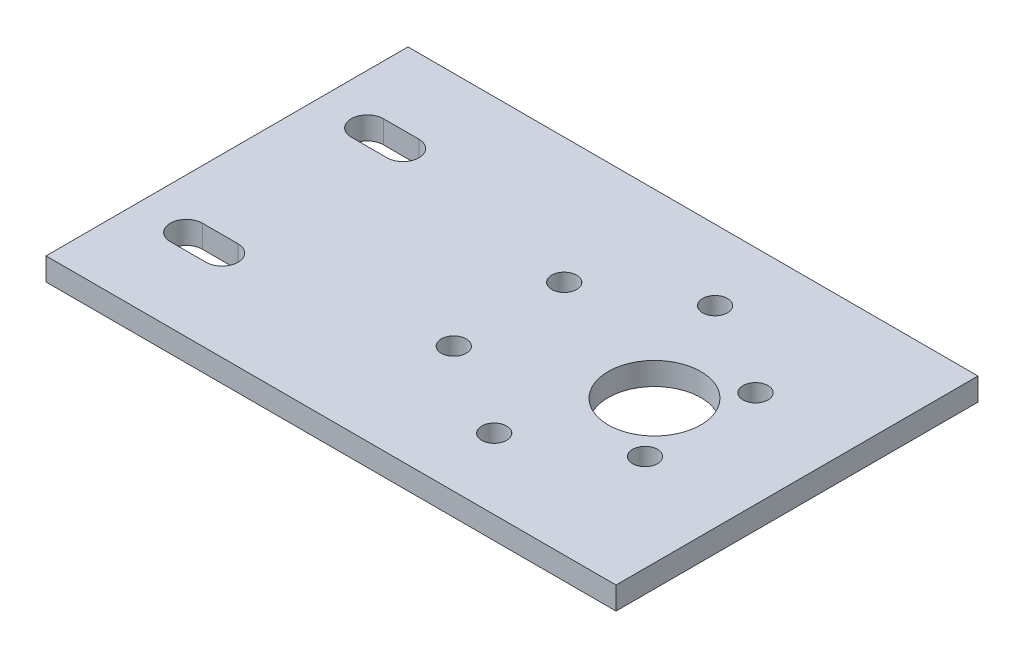
ISO-10303-21;
HEADER;
FILE_DESCRIPTION(('STEP AP214'),'2;1');
FILE_NAME('part.step','',(''),(''),'','','');
FILE_SCHEMA(('AUTOMOTIVE_DESIGN { 1 0 10303 214 1 1 1 1 }'));
ENDSEC;
DATA;
#1=APPLICATION_CONTEXT('core data for automotive mechanical design processes');
#2=APPLICATION_PROTOCOL_DEFINITION('international standard','automotive_design',2000,#1);
#3=PRODUCT_CONTEXT('',#1,'mechanical');
#4=PRODUCT('Part','Part','',(#3));
#5=PRODUCT_RELATED_PRODUCT_CATEGORY('part','',(#4));
#6=PRODUCT_DEFINITION_FORMATION('','',#4);
#7=PRODUCT_DEFINITION_CONTEXT('part definition',#1,'design');
#8=PRODUCT_DEFINITION('design','',#6,#7);
#9=PRODUCT_DEFINITION_SHAPE('','',#8);
#10=(LENGTH_UNIT() NAMED_UNIT(*) SI_UNIT(.MILLI.,.METRE.));
#11=(NAMED_UNIT(*) PLANE_ANGLE_UNIT() SI_UNIT($,.RADIAN.));
#12=(NAMED_UNIT(*) SI_UNIT($,.STERADIAN.) SOLID_ANGLE_UNIT());
#13=UNCERTAINTY_MEASURE_WITH_UNIT(LENGTH_MEASURE(1.E-05),#10,'distance_accuracy_value','');
#14=(GEOMETRIC_REPRESENTATION_CONTEXT(3) GLOBAL_UNCERTAINTY_ASSIGNED_CONTEXT((#13)) GLOBAL_UNIT_ASSIGNED_CONTEXT((#10,
#11,#12)) REPRESENTATION_CONTEXT('',''));
#15=CARTESIAN_POINT('',(0.,0.,0.));
#16=DIRECTION('',(0.,0.,1.));
#17=DIRECTION('',(1.,0.,0.));
#18=AXIS2_PLACEMENT_3D('',#15,#16,#17);
#19=CARTESIAN_POINT('',(0.,3.175,0.));
#20=DIRECTION('',(0.,-1.,0.));
#21=DIRECTION('',(0.,0.,-1.));
#22=AXIS2_PLACEMENT_3D('',#19,#20,#21);
#23=PLANE('',#22);
#24=CARTESIAN_POINT('',(62.1266062413418,3.175,-11.2999999999994));
#25=DIRECTION('',(0.,1.,0.));
#26=DIRECTION('',(0.,0.,1.));
#27=AXIS2_PLACEMENT_3D('',#24,#25,#26);
#28=CIRCLE('',#27,1.74999999999999);
#29=CARTESIAN_POINT('',(62.1266062413418,3.175,-9.54999999999942));
#30=VERTEX_POINT('',#29);
#31=EDGE_CURVE('E168',#30,#30,#28,.T.);
#32=ORIENTED_EDGE('',*,*,#31,.F.);
#33=EDGE_LOOP('',(#32));
#34=FACE_BOUND('',#33,.T.);
#35=CARTESIAN_POINT('',(88.9733937586594,3.175,-11.3));
#36=DIRECTION('',(0.,1.,0.));
#37=DIRECTION('',(0.,0.,1.));
#38=AXIS2_PLACEMENT_3D('',#35,#36,#37);
#39=CIRCLE('',#38,1.74999999999999);
#40=CARTESIAN_POINT('',(88.9733937586594,3.175,-9.54999999999998));
#41=VERTEX_POINT('',#40);
#42=EDGE_CURVE('E180',#41,#41,#39,.T.);
#43=ORIENTED_EDGE('',*,*,#42,.F.);
#44=EDGE_LOOP('',(#43));
#45=FACE_BOUND('',#44,.T.);
#46=CARTESIAN_POINT('',(88.973393758659,3.175,-26.8));
#47=DIRECTION('',(0.,1.,0.));
#48=DIRECTION('',(0.,0.,1.));
#49=AXIS2_PLACEMENT_3D('',#46,#47,#48);
#50=CIRCLE('',#49,1.74999999999999);
#51=CARTESIAN_POINT('',(88.973393758659,3.175,-25.05));
#52=VERTEX_POINT('',#51);
#53=EDGE_CURVE('E211',#52,#52,#50,.T.);
#54=ORIENTED_EDGE('',*,*,#53,.F.);
#55=EDGE_LOOP('',(#54));
#56=FACE_BOUND('',#55,.T.);
#57=CARTESIAN_POINT('',(82.55,3.175,-19.0499999999997));
#58=DIRECTION('',(0.,1.,0.));
#59=DIRECTION('',(0.,0.,1.));
#60=AXIS2_PLACEMENT_3D('',#57,#58,#59);
#61=CIRCLE('',#60,6.5);
#62=CARTESIAN_POINT('',(82.55,3.175,-12.5499999999997));
#63=VERTEX_POINT('',#62);
#64=EDGE_CURVE('E223',#63,#63,#61,.T.);
#65=ORIENTED_EDGE('',*,*,#64,.F.);
#66=EDGE_LOOP('',(#65));
#67=FACE_BOUND('',#66,.T.);
#68=DIRECTION('',(0.,0.,-1.));
#69=VECTOR('',#68,1.);
#70=CARTESIAN_POINT('',(102.55,3.175,3.36536354339501E-13));
#71=LINE('',#70,#69);
#72=CARTESIAN_POINT('',(102.55,3.175,6.34999999999869));
#73=VERTEX_POINT('',#72);
#74=CARTESIAN_POINT('',(102.55,3.175,-44.4499999999993));
#75=VERTEX_POINT('',#74);
#76=EDGE_CURVE('E42',#73,#75,#71,.T.);
#77=ORIENTED_EDGE('',*,*,#76,.T.);
#78=DIRECTION('',(-1.,0.,0.));
#79=VECTOR('',#78,1.);
#80=CARTESIAN_POINT('',(22.55,3.175,-44.4499999999993));
#81=LINE('',#80,#79);
#82=CARTESIAN_POINT('',(22.55,3.175,-44.4499999999993));
#83=VERTEX_POINT('',#82);
#84=EDGE_CURVE('E151',#75,#83,#81,.T.);
#85=ORIENTED_EDGE('',*,*,#84,.T.);
#86=DIRECTION('',(0.,0.,1.));
#87=VECTOR('',#86,1.);
#88=CARTESIAN_POINT('',(22.55,3.175,-38.0999999999993));
#89=LINE('',#88,#87);
#90=CARTESIAN_POINT('',(22.55,3.175,6.3499999999987));
#91=VERTEX_POINT('',#90);
#92=EDGE_CURVE('E11',#83,#91,#89,.T.);
#93=ORIENTED_EDGE('',*,*,#92,.T.);
#94=DIRECTION('',(1.,0.,0.));
#95=VECTOR('',#94,1.);
#96=CARTESIAN_POINT('',(102.55,3.175,6.34999999999869));
#97=LINE('',#96,#95);
#98=EDGE_CURVE('E142',#91,#73,#97,.T.);
#99=ORIENTED_EDGE('',*,*,#98,.T.);
#100=EDGE_LOOP('',(#77,#85,#93,#99));
#101=FACE_BOUND('',#100,.T.);
#102=CARTESIAN_POINT('',(29.55,3.175,-31.75));
#103=DIRECTION('',(0.,1.,0.));
#104=DIRECTION('',(0.,0.,1.));
#105=AXIS2_PLACEMENT_3D('',#102,#103,#104);
#106=CIRCLE('',#105,2.25);
#107=CARTESIAN_POINT('',(29.55,3.175,-34.));
#108=VERTEX_POINT('',#107);
#109=CARTESIAN_POINT('',(29.55,3.175,-29.5));
#110=VERTEX_POINT('',#109);
#111=EDGE_CURVE('E229',#108,#110,#106,.T.);
#112=ORIENTED_EDGE('',*,*,#111,.F.);
#113=DIRECTION('',(-1.,0.,0.));
#114=VECTOR('',#113,1.);
#115=CARTESIAN_POINT('',(29.55,3.175,-34.));
#116=LINE('',#115,#114);
#117=CARTESIAN_POINT('',(34.55,3.175,-34.));
#118=VERTEX_POINT('',#117);
#119=EDGE_CURVE('E237',#118,#108,#116,.T.);
#120=ORIENTED_EDGE('',*,*,#119,.F.);
#121=CARTESIAN_POINT('',(34.55,3.175,-31.75));
#122=DIRECTION('',(0.,1.,0.));
#123=DIRECTION('',(0.,0.,1.));
#124=AXIS2_PLACEMENT_3D('',#121,#122,#123);
#125=CIRCLE('',#124,2.25);
#126=CARTESIAN_POINT('',(34.55,3.175,-29.5));
#127=VERTEX_POINT('',#126);
#128=EDGE_CURVE('E234',#127,#118,#125,.T.);
#129=ORIENTED_EDGE('',*,*,#128,.F.);
#130=DIRECTION('',(1.,0.,0.));
#131=VECTOR('',#130,1.);
#132=CARTESIAN_POINT('',(29.55,3.175,-29.5));
#133=LINE('',#132,#131);
#134=EDGE_CURVE('E231',#110,#127,#133,.T.);
#135=ORIENTED_EDGE('',*,*,#134,.F.);
#136=EDGE_LOOP('',(#112,#120,#129,#135));
#137=FACE_BOUND('',#136,.T.);
#138=CARTESIAN_POINT('',(75.55,3.175,-34.5499999999997));
#139=DIRECTION('',(0.,1.,0.));
#140=DIRECTION('',(0.,0.,1.));
#141=AXIS2_PLACEMENT_3D('',#138,#139,#140);
#142=CIRCLE('',#141,1.75);
#143=CARTESIAN_POINT('',(75.55,3.175,-32.7999999999997));
#144=VERTEX_POINT('',#143);
#145=EDGE_CURVE('E217',#144,#144,#142,.T.);
#146=ORIENTED_EDGE('',*,*,#145,.F.);
#147=EDGE_LOOP('',(#146));
#148=FACE_BOUND('',#147,.T.);
#149=CARTESIAN_POINT('',(29.55,3.175,-6.35));
#150=DIRECTION('',(0.,1.,0.));
#151=DIRECTION('',(0.,0.,1.));
#152=AXIS2_PLACEMENT_3D('',#149,#150,#151);
#153=CIRCLE('',#152,2.25);
#154=CARTESIAN_POINT('',(29.55,3.175,-8.6));
#155=VERTEX_POINT('',#154);
#156=CARTESIAN_POINT('',(29.55,3.175,-4.1));
#157=VERTEX_POINT('',#156);
#158=EDGE_CURVE('E185',#155,#157,#153,.T.);
#159=ORIENTED_EDGE('',*,*,#158,.F.);
#160=DIRECTION('',(-1.,0.,0.));
#161=VECTOR('',#160,1.);
#162=CARTESIAN_POINT('',(29.55,3.175,-8.6));
#163=LINE('',#162,#161);
#164=CARTESIAN_POINT('',(34.55,3.175,-8.6));
#165=VERTEX_POINT('',#164);
#166=EDGE_CURVE('E192',#165,#155,#163,.T.);
#167=ORIENTED_EDGE('',*,*,#166,.F.);
#168=CARTESIAN_POINT('',(34.55,3.175,-6.35));
#169=DIRECTION('',(0.,1.,0.));
#170=DIRECTION('',(0.,0.,1.));
#171=AXIS2_PLACEMENT_3D('',#168,#169,#170);
#172=CIRCLE('',#171,2.25);
#173=CARTESIAN_POINT('',(34.55,3.175,-4.1));
#174=VERTEX_POINT('',#173);
#175=EDGE_CURVE('E190',#174,#165,#172,.T.);
#176=ORIENTED_EDGE('',*,*,#175,.F.);
#177=DIRECTION('',(1.,0.,0.));
#178=VECTOR('',#177,1.);
#179=CARTESIAN_POINT('',(29.55,3.175,-4.1));
#180=LINE('',#179,#178);
#181=EDGE_CURVE('E187',#157,#174,#180,.T.);
#182=ORIENTED_EDGE('',*,*,#181,.F.);
#183=EDGE_LOOP('',(#159,#167,#176,#182));
#184=FACE_BOUND('',#183,.T.);
#185=CARTESIAN_POINT('',(75.5500000000008,3.175,-3.54999999999966));
#186=DIRECTION('',(0.,1.,0.));
#187=DIRECTION('',(0.,0.,1.));
#188=AXIS2_PLACEMENT_3D('',#185,#186,#187);
#189=CIRCLE('',#188,1.75000000000001);
#190=CARTESIAN_POINT('',(75.5500000000008,3.175,-1.79999999999966));
#191=VERTEX_POINT('',#190);
#192=EDGE_CURVE('E174',#191,#191,#189,.T.);
#193=ORIENTED_EDGE('',*,*,#192,.F.);
#194=EDGE_LOOP('',(#193));
#195=FACE_BOUND('',#194,.T.);
#196=CARTESIAN_POINT('',(62.1266062413415,3.175,-26.7999999999994));
#197=DIRECTION('',(0.,1.,0.));
#198=DIRECTION('',(0.,0.,1.));
#199=AXIS2_PLACEMENT_3D('',#196,#197,#198);
#200=CIRCLE('',#199,1.75);
#201=CARTESIAN_POINT('',(62.1266062413415,3.175,-25.0499999999994));
#202=VERTEX_POINT('',#201);
#203=EDGE_CURVE('E162',#202,#202,#200,.T.);
#204=ORIENTED_EDGE('',*,*,#203,.F.);
#205=EDGE_LOOP('',(#204));
#206=FACE_BOUND('',#205,.T.);
#207=ADVANCED_FACE('F33',(#34,#45,#56,#67,#101,#137,#148,#184,#195,#206),#23,.F.);
#208=CARTESIAN_POINT('',(0.,0.,0.));
#209=DIRECTION('',(0.,-1.,0.));
#210=DIRECTION('',(0.,0.,-1.));
#211=AXIS2_PLACEMENT_3D('',#208,#209,#210);
#212=PLANE('',#211);
#213=CARTESIAN_POINT('',(62.1266062413418,0.,-11.2999999999994));
#214=DIRECTION('',(0.,1.,0.));
#215=DIRECTION('',(0.,0.,1.));
#216=AXIS2_PLACEMENT_3D('',#213,#214,#215);
#217=CIRCLE('',#216,1.74999999999999);
#218=CARTESIAN_POINT('',(62.1266062413418,0.,-9.54999999999942));
#219=VERTEX_POINT('',#218);
#220=EDGE_CURVE('E165',#219,#219,#217,.T.);
#221=ORIENTED_EDGE('',*,*,#220,.T.);
#222=EDGE_LOOP('',(#221));
#223=FACE_BOUND('',#222,.T.);
#224=CARTESIAN_POINT('',(88.9733937586594,0.,-11.3));
#225=DIRECTION('',(0.,1.,0.));
#226=DIRECTION('',(0.,0.,1.));
#227=AXIS2_PLACEMENT_3D('',#224,#225,#226);
#228=CIRCLE('',#227,1.74999999999999);
#229=CARTESIAN_POINT('',(88.9733937586594,0.,-9.54999999999998));
#230=VERTEX_POINT('',#229);
#231=EDGE_CURVE('E177',#230,#230,#228,.T.);
#232=ORIENTED_EDGE('',*,*,#231,.T.);
#233=EDGE_LOOP('',(#232));
#234=FACE_BOUND('',#233,.T.);
#235=CARTESIAN_POINT('',(88.973393758659,0.,-26.8));
#236=DIRECTION('',(0.,1.,0.));
#237=DIRECTION('',(0.,0.,1.));
#238=AXIS2_PLACEMENT_3D('',#235,#236,#237);
#239=CIRCLE('',#238,1.74999999999999);
#240=CARTESIAN_POINT('',(88.973393758659,0.,-25.05));
#241=VERTEX_POINT('',#240);
#242=EDGE_CURVE('E210',#241,#241,#239,.T.);
#243=ORIENTED_EDGE('',*,*,#242,.T.);
#244=EDGE_LOOP('',(#243));
#245=FACE_BOUND('',#244,.T.);
#246=CARTESIAN_POINT('',(82.55,0.,-19.0499999999997));
#247=DIRECTION('',(0.,1.,0.));
#248=DIRECTION('',(0.,0.,1.));
#249=AXIS2_PLACEMENT_3D('',#246,#247,#248);
#250=CIRCLE('',#249,6.5);
#251=CARTESIAN_POINT('',(82.55,0.,-12.5499999999997));
#252=VERTEX_POINT('',#251);
#253=EDGE_CURVE('E220',#252,#252,#250,.T.);
#254=ORIENTED_EDGE('',*,*,#253,.T.);
#255=EDGE_LOOP('',(#254));
#256=FACE_BOUND('',#255,.T.);
#257=DIRECTION('',(0.,0.,-1.));
#258=VECTOR('',#257,1.);
#259=CARTESIAN_POINT('',(102.55,0.,3.36536354339501E-13));
#260=LINE('',#259,#258);
#261=CARTESIAN_POINT('',(102.55,0.,6.34999999999869));
#262=VERTEX_POINT('',#261);
#263=CARTESIAN_POINT('',(102.55,0.,-44.4499999999993));
#264=VERTEX_POINT('',#263);
#265=EDGE_CURVE('E135',#262,#264,#260,.T.);
#266=ORIENTED_EDGE('',*,*,#265,.F.);
#267=DIRECTION('',(1.,0.,0.));
#268=VECTOR('',#267,1.);
#269=CARTESIAN_POINT('',(102.55,0.,6.34999999999869));
#270=LINE('',#269,#268);
#271=CARTESIAN_POINT('',(22.55,0.,6.3499999999987));
#272=VERTEX_POINT('',#271);
#273=EDGE_CURVE('E140',#272,#262,#270,.T.);
#274=ORIENTED_EDGE('',*,*,#273,.F.);
#275=DIRECTION('',(0.,0.,1.));
#276=VECTOR('',#275,1.);
#277=CARTESIAN_POINT('',(22.55,0.,-38.0999999999993));
#278=LINE('',#277,#276);
#279=CARTESIAN_POINT('',(22.55,0.,-44.4499999999993));
#280=VERTEX_POINT('',#279);
#281=EDGE_CURVE('E37',#280,#272,#278,.T.);
#282=ORIENTED_EDGE('',*,*,#281,.F.);
#283=DIRECTION('',(-1.,0.,0.));
#284=VECTOR('',#283,1.);
#285=CARTESIAN_POINT('',(22.55,0.,-44.4499999999993));
#286=LINE('',#285,#284);
#287=EDGE_CURVE('E153',#264,#280,#286,.T.);
#288=ORIENTED_EDGE('',*,*,#287,.F.);
#289=EDGE_LOOP('',(#266,#274,#282,#288));
#290=FACE_BOUND('',#289,.T.);
#291=DIRECTION('',(-1.,0.,0.));
#292=VECTOR('',#291,1.);
#293=CARTESIAN_POINT('',(29.55,0.,-34.));
#294=LINE('',#293,#292);
#295=CARTESIAN_POINT('',(34.55,0.,-34.));
#296=VERTEX_POINT('',#295);
#297=CARTESIAN_POINT('',(29.55,0.,-34.));
#298=VERTEX_POINT('',#297);
#299=EDGE_CURVE('E232',#296,#298,#294,.T.);
#300=ORIENTED_EDGE('',*,*,#299,.T.);
#301=CARTESIAN_POINT('',(29.55,0.,-31.75));
#302=DIRECTION('',(0.,1.,0.));
#303=DIRECTION('',(0.,0.,1.));
#304=AXIS2_PLACEMENT_3D('',#301,#302,#303);
#305=CIRCLE('',#304,2.25);
#306=CARTESIAN_POINT('',(29.55,0.,-29.5));
#307=VERTEX_POINT('',#306);
#308=EDGE_CURVE('E226',#298,#307,#305,.T.);
#309=ORIENTED_EDGE('',*,*,#308,.T.);
#310=DIRECTION('',(1.,0.,0.));
#311=VECTOR('',#310,1.);
#312=CARTESIAN_POINT('',(29.55,0.,-29.5));
#313=LINE('',#312,#311);
#314=CARTESIAN_POINT('',(34.55,0.,-29.5));
#315=VERTEX_POINT('',#314);
#316=EDGE_CURVE('E242',#307,#315,#313,.T.);
#317=ORIENTED_EDGE('',*,*,#316,.T.);
#318=CARTESIAN_POINT('',(34.55,0.,-31.75));
#319=DIRECTION('',(0.,1.,0.));
#320=DIRECTION('',(0.,0.,1.));
#321=AXIS2_PLACEMENT_3D('',#318,#319,#320);
#322=CIRCLE('',#321,2.25);
#323=EDGE_CURVE('E245',#315,#296,#322,.T.);
#324=ORIENTED_EDGE('',*,*,#323,.T.);
#325=EDGE_LOOP('',(#300,#309,#317,#324));
#326=FACE_BOUND('',#325,.T.);
#327=CARTESIAN_POINT('',(75.55,0.,-34.5499999999997));
#328=DIRECTION('',(0.,1.,0.));
#329=DIRECTION('',(0.,0.,1.));
#330=AXIS2_PLACEMENT_3D('',#327,#328,#329);
#331=CIRCLE('',#330,1.75);
#332=CARTESIAN_POINT('',(75.55,0.,-32.7999999999997));
#333=VERTEX_POINT('',#332);
#334=EDGE_CURVE('E214',#333,#333,#331,.T.);
#335=ORIENTED_EDGE('',*,*,#334,.T.);
#336=EDGE_LOOP('',(#335));
#337=FACE_BOUND('',#336,.T.);
#338=DIRECTION('',(-1.,0.,0.));
#339=VECTOR('',#338,1.);
#340=CARTESIAN_POINT('',(29.55,0.,-8.6));
#341=LINE('',#340,#339);
#342=CARTESIAN_POINT('',(34.55,0.,-8.6));
#343=VERTEX_POINT('',#342);
#344=CARTESIAN_POINT('',(29.55,0.,-8.6));
#345=VERTEX_POINT('',#344);
#346=EDGE_CURVE('E188',#343,#345,#341,.T.);
#347=ORIENTED_EDGE('',*,*,#346,.T.);
#348=CARTESIAN_POINT('',(29.55,0.,-6.35));
#349=DIRECTION('',(0.,1.,0.));
#350=DIRECTION('',(0.,0.,1.));
#351=AXIS2_PLACEMENT_3D('',#348,#349,#350);
#352=CIRCLE('',#351,2.25);
#353=CARTESIAN_POINT('',(29.55,0.,-4.1));
#354=VERTEX_POINT('',#353);
#355=EDGE_CURVE('E58',#345,#354,#352,.T.);
#356=ORIENTED_EDGE('',*,*,#355,.T.);
#357=DIRECTION('',(1.,0.,0.));
#358=VECTOR('',#357,1.);
#359=CARTESIAN_POINT('',(29.55,0.,-4.1));
#360=LINE('',#359,#358);
#361=CARTESIAN_POINT('',(34.55,0.,-4.1));
#362=VERTEX_POINT('',#361);
#363=EDGE_CURVE('E196',#354,#362,#360,.T.);
#364=ORIENTED_EDGE('',*,*,#363,.T.);
#365=CARTESIAN_POINT('',(34.55,0.,-6.35));
#366=DIRECTION('',(0.,1.,0.));
#367=DIRECTION('',(0.,0.,1.));
#368=AXIS2_PLACEMENT_3D('',#365,#366,#367);
#369=CIRCLE('',#368,2.25);
#370=EDGE_CURVE('E199',#362,#343,#369,.T.);
#371=ORIENTED_EDGE('',*,*,#370,.T.);
#372=EDGE_LOOP('',(#347,#356,#364,#371));
#373=FACE_BOUND('',#372,.T.);
#374=CARTESIAN_POINT('',(75.5500000000008,0.,-3.54999999999966));
#375=DIRECTION('',(0.,1.,0.));
#376=DIRECTION('',(0.,0.,1.));
#377=AXIS2_PLACEMENT_3D('',#374,#375,#376);
#378=CIRCLE('',#377,1.75000000000001);
#379=CARTESIAN_POINT('',(75.5500000000008,0.,-1.79999999999966));
#380=VERTEX_POINT('',#379);
#381=EDGE_CURVE('E171',#380,#380,#378,.T.);
#382=ORIENTED_EDGE('',*,*,#381,.T.);
#383=EDGE_LOOP('',(#382));
#384=FACE_BOUND('',#383,.T.);
#385=CARTESIAN_POINT('',(62.1266062413415,0.,-26.7999999999994));
#386=DIRECTION('',(0.,1.,0.));
#387=DIRECTION('',(0.,0.,1.));
#388=AXIS2_PLACEMENT_3D('',#385,#386,#387);
#389=CIRCLE('',#388,1.75);
#390=CARTESIAN_POINT('',(62.1266062413415,0.,-25.0499999999994));
#391=VERTEX_POINT('',#390);
#392=EDGE_CURVE('E159',#391,#391,#389,.T.);
#393=ORIENTED_EDGE('',*,*,#392,.T.);
#394=EDGE_LOOP('',(#393));
#395=FACE_BOUND('',#394,.T.);
#396=ADVANCED_FACE('F145',(#223,#234,#245,#256,#290,#326,#337,#373,#384,#395),#212,.T.);
#397=CARTESIAN_POINT('',(102.55,3.175,3.36536354339501E-13));
#398=DIRECTION('',(-1.,0.,0.));
#399=DIRECTION('',(0.,0.,1.));
#400=AXIS2_PLACEMENT_3D('',#397,#398,#399);
#401=PLANE('',#400);
#402=ORIENTED_EDGE('',*,*,#265,.T.);
#403=DIRECTION('',(0.,1.,0.));
#404=VECTOR('',#403,1.);
#405=CARTESIAN_POINT('',(102.55,0.,-44.4499999999993));
#406=LINE('',#405,#404);
#407=EDGE_CURVE('E155',#264,#75,#406,.T.);
#408=ORIENTED_EDGE('',*,*,#407,.T.);
#409=ORIENTED_EDGE('',*,*,#76,.F.);
#410=DIRECTION('',(0.,1.,0.));
#411=VECTOR('',#410,1.);
#412=CARTESIAN_POINT('',(102.55,0.,6.34999999999869));
#413=LINE('',#412,#411);
#414=EDGE_CURVE('E143',#262,#73,#413,.T.);
#415=ORIENTED_EDGE('',*,*,#414,.F.);
#416=EDGE_LOOP('',(#402,#408,#409,#415));
#417=FACE_BOUND('',#416,.T.);
#418=ADVANCED_FACE('F35',(#417),#401,.F.);
#419=CARTESIAN_POINT('',(22.55,3.175,-38.0999999999993));
#420=DIRECTION('',(1.,0.,0.));
#421=DIRECTION('',(0.,0.,-1.));
#422=AXIS2_PLACEMENT_3D('',#419,#420,#421);
#423=PLANE('',#422);
#424=ORIENTED_EDGE('',*,*,#281,.T.);
#425=DIRECTION('',(0.,1.,0.));
#426=VECTOR('',#425,1.);
#427=CARTESIAN_POINT('',(22.55,0.,6.3499999999987));
#428=LINE('',#427,#426);
#429=EDGE_CURVE('E127',#272,#91,#428,.T.);
#430=ORIENTED_EDGE('',*,*,#429,.T.);
#431=ORIENTED_EDGE('',*,*,#92,.F.);
#432=DIRECTION('',(0.,1.,0.));
#433=VECTOR('',#432,1.);
#434=CARTESIAN_POINT('',(22.55,0.,-44.4499999999993));
#435=LINE('',#434,#433);
#436=EDGE_CURVE('E130',#280,#83,#435,.T.);
#437=ORIENTED_EDGE('',*,*,#436,.F.);
#438=EDGE_LOOP('',(#424,#430,#431,#437));
#439=FACE_BOUND('',#438,.T.);
#440=ADVANCED_FACE('F126',(#439),#423,.F.);
#441=CARTESIAN_POINT('',(29.55,3.175,-31.75));
#442=DIRECTION('',(0.,-1.,0.));
#443=DIRECTION('',(0.,0.,-1.));
#444=AXIS2_PLACEMENT_3D('',#441,#442,#443);
#445=CYLINDRICAL_SURFACE('',#444,2.25);
#446=ORIENTED_EDGE('',*,*,#308,.F.);
#447=DIRECTION('',(0.,-1.,0.));
#448=VECTOR('',#447,1.);
#449=CARTESIAN_POINT('',(29.55,3.175,-34.));
#450=LINE('',#449,#448);
#451=EDGE_CURVE('E239',#108,#298,#450,.T.);
#452=ORIENTED_EDGE('',*,*,#451,.F.);
#453=ORIENTED_EDGE('',*,*,#111,.T.);
#454=DIRECTION('',(0.,-1.,0.));
#455=VECTOR('',#454,1.);
#456=CARTESIAN_POINT('',(29.55,3.175,-29.5));
#457=LINE('',#456,#455);
#458=EDGE_CURVE('E256',#110,#307,#457,.T.);
#459=ORIENTED_EDGE('',*,*,#458,.T.);
#460=EDGE_LOOP('',(#446,#452,#453,#459));
#461=FACE_BOUND('',#460,.T.);
#462=ADVANCED_FACE('F299',(#461),#445,.F.);
#463=CARTESIAN_POINT('',(29.55,3.175,-29.5));
#464=DIRECTION('',(0.,0.,-1.));
#465=DIRECTION('',(-1.,0.,0.));
#466=AXIS2_PLACEMENT_3D('',#463,#464,#465);
#467=PLANE('',#466);
#468=ORIENTED_EDGE('',*,*,#316,.F.);
#469=ORIENTED_EDGE('',*,*,#458,.F.);
#470=ORIENTED_EDGE('',*,*,#134,.T.);
#471=DIRECTION('',(0.,-1.,0.));
#472=VECTOR('',#471,1.);
#473=CARTESIAN_POINT('',(34.55,3.175,-29.5));
#474=LINE('',#473,#472);
#475=EDGE_CURVE('E254',#127,#315,#474,.T.);
#476=ORIENTED_EDGE('',*,*,#475,.T.);
#477=EDGE_LOOP('',(#468,#469,#470,#476));
#478=FACE_BOUND('',#477,.T.);
#479=ADVANCED_FACE('F304',(#478),#467,.T.);
#480=CARTESIAN_POINT('',(34.55,3.175,-31.75));
#481=DIRECTION('',(0.,-1.,0.));
#482=DIRECTION('',(0.,0.,-1.));
#483=AXIS2_PLACEMENT_3D('',#480,#481,#482);
#484=CYLINDRICAL_SURFACE('',#483,2.25);
#485=ORIENTED_EDGE('',*,*,#323,.F.);
#486=ORIENTED_EDGE('',*,*,#475,.F.);
#487=ORIENTED_EDGE('',*,*,#128,.T.);
#488=DIRECTION('',(0.,-1.,0.));
#489=VECTOR('',#488,1.);
#490=CARTESIAN_POINT('',(34.55,3.175,-34.));
#491=LINE('',#490,#489);
#492=EDGE_CURVE('E252',#118,#296,#491,.T.);
#493=ORIENTED_EDGE('',*,*,#492,.T.);
#494=EDGE_LOOP('',(#485,#486,#487,#493));
#495=FACE_BOUND('',#494,.T.);
#496=ADVANCED_FACE('F309',(#495),#484,.F.);
#497=CARTESIAN_POINT('',(29.55,3.175,-34.));
#498=DIRECTION('',(0.,0.,1.));
#499=DIRECTION('',(1.,0.,0.));
#500=AXIS2_PLACEMENT_3D('',#497,#498,#499);
#501=PLANE('',#500);
#502=ORIENTED_EDGE('',*,*,#299,.F.);
#503=ORIENTED_EDGE('',*,*,#492,.F.);
#504=ORIENTED_EDGE('',*,*,#119,.T.);
#505=ORIENTED_EDGE('',*,*,#451,.T.);
#506=EDGE_LOOP('',(#502,#503,#504,#505));
#507=FACE_BOUND('',#506,.T.);
#508=ADVANCED_FACE('F315',(#507),#501,.T.);
#509=CARTESIAN_POINT('',(82.55,3.175,-19.0499999999997));
#510=DIRECTION('',(0.,-1.,0.));
#511=DIRECTION('',(0.,0.,-1.));
#512=AXIS2_PLACEMENT_3D('',#509,#510,#511);
#513=CYLINDRICAL_SURFACE('',#512,6.5);
#514=ORIENTED_EDGE('',*,*,#64,.T.);
#515=EDGE_LOOP('',(#514));
#516=FACE_BOUND('',#515,.T.);
#517=ORIENTED_EDGE('',*,*,#253,.F.);
#518=EDGE_LOOP('',(#517));
#519=FACE_BOUND('',#518,.T.);
#520=ADVANCED_FACE('F319',(#516,#519),#513,.F.);
#521=CARTESIAN_POINT('',(75.55,3.175,-34.5499999999997));
#522=DIRECTION('',(0.,-1.,0.));
#523=DIRECTION('',(0.,0.,-1.));
#524=AXIS2_PLACEMENT_3D('',#521,#522,#523);
#525=CYLINDRICAL_SURFACE('',#524,1.75);
#526=ORIENTED_EDGE('',*,*,#145,.T.);
#527=EDGE_LOOP('',(#526));
#528=FACE_BOUND('',#527,.T.);
#529=ORIENTED_EDGE('',*,*,#334,.F.);
#530=EDGE_LOOP('',(#529));
#531=FACE_BOUND('',#530,.T.);
#532=ADVANCED_FACE('F323',(#528,#531),#525,.F.);
#533=CARTESIAN_POINT('',(88.973393758659,3.175,-26.8));
#534=DIRECTION('',(0.,-1.,0.));
#535=DIRECTION('',(0.,0.,-1.));
#536=AXIS2_PLACEMENT_3D('',#533,#534,#535);
#537=CYLINDRICAL_SURFACE('',#536,1.74999999999999);
#538=ORIENTED_EDGE('',*,*,#53,.T.);
#539=EDGE_LOOP('',(#538));
#540=FACE_BOUND('',#539,.T.);
#541=ORIENTED_EDGE('',*,*,#242,.F.);
#542=EDGE_LOOP('',(#541));
#543=FACE_BOUND('',#542,.T.);
#544=ADVANCED_FACE('F327',(#540,#543),#537,.F.);
#545=CARTESIAN_POINT('',(29.55,3.175,-6.35));
#546=DIRECTION('',(0.,-1.,0.));
#547=DIRECTION('',(0.,0.,-1.));
#548=AXIS2_PLACEMENT_3D('',#545,#546,#547);
#549=CYLINDRICAL_SURFACE('',#548,2.25);
#550=ORIENTED_EDGE('',*,*,#355,.F.);
#551=DIRECTION('',(0.,-1.,0.));
#552=VECTOR('',#551,1.);
#553=CARTESIAN_POINT('',(29.55,3.175,-8.6));
#554=LINE('',#553,#552);
#555=EDGE_CURVE('E194',#155,#345,#554,.T.);
#556=ORIENTED_EDGE('',*,*,#555,.F.);
#557=ORIENTED_EDGE('',*,*,#158,.T.);
#558=DIRECTION('',(0.,-1.,0.));
#559=VECTOR('',#558,1.);
#560=CARTESIAN_POINT('',(29.55,3.175,-4.1));
#561=LINE('',#560,#559);
#562=EDGE_CURVE('E208',#157,#354,#561,.T.);
#563=ORIENTED_EDGE('',*,*,#562,.T.);
#564=EDGE_LOOP('',(#550,#556,#557,#563));
#565=FACE_BOUND('',#564,.T.);
#566=ADVANCED_FACE('F331',(#565),#549,.F.);
#567=CARTESIAN_POINT('',(29.55,3.175,-4.1));
#568=DIRECTION('',(0.,0.,-1.));
#569=DIRECTION('',(-1.,0.,0.));
#570=AXIS2_PLACEMENT_3D('',#567,#568,#569);
#571=PLANE('',#570);
#572=ORIENTED_EDGE('',*,*,#363,.F.);
#573=ORIENTED_EDGE('',*,*,#562,.F.);
#574=ORIENTED_EDGE('',*,*,#181,.T.);
#575=DIRECTION('',(0.,-1.,0.));
#576=VECTOR('',#575,1.);
#577=CARTESIAN_POINT('',(34.55,3.175,-4.1));
#578=LINE('',#577,#576);
#579=EDGE_CURVE('E206',#174,#362,#578,.T.);
#580=ORIENTED_EDGE('',*,*,#579,.T.);
#581=EDGE_LOOP('',(#572,#573,#574,#580));
#582=FACE_BOUND('',#581,.T.);
#583=ADVANCED_FACE('F335',(#582),#571,.T.);
#584=CARTESIAN_POINT('',(34.55,3.175,-6.35));
#585=DIRECTION('',(0.,-1.,0.));
#586=DIRECTION('',(0.,0.,-1.));
#587=AXIS2_PLACEMENT_3D('',#584,#585,#586);
#588=CYLINDRICAL_SURFACE('',#587,2.25);
#589=ORIENTED_EDGE('',*,*,#370,.F.);
#590=ORIENTED_EDGE('',*,*,#579,.F.);
#591=ORIENTED_EDGE('',*,*,#175,.T.);
#592=DIRECTION('',(0.,-1.,0.));
#593=VECTOR('',#592,1.);
#594=CARTESIAN_POINT('',(34.55,3.175,-8.6));
#595=LINE('',#594,#593);
#596=EDGE_CURVE('E50',#165,#343,#595,.T.);
#597=ORIENTED_EDGE('',*,*,#596,.T.);
#598=EDGE_LOOP('',(#589,#590,#591,#597));
#599=FACE_BOUND('',#598,.T.);
#600=ADVANCED_FACE('F338',(#599),#588,.F.);
#601=CARTESIAN_POINT('',(29.55,3.175,-8.6));
#602=DIRECTION('',(0.,0.,1.));
#603=DIRECTION('',(1.,0.,0.));
#604=AXIS2_PLACEMENT_3D('',#601,#602,#603);
#605=PLANE('',#604);
#606=ORIENTED_EDGE('',*,*,#346,.F.);
#607=ORIENTED_EDGE('',*,*,#596,.F.);
#608=ORIENTED_EDGE('',*,*,#166,.T.);
#609=ORIENTED_EDGE('',*,*,#555,.T.);
#610=EDGE_LOOP('',(#606,#607,#608,#609));
#611=FACE_BOUND('',#610,.T.);
#612=ADVANCED_FACE('F342',(#611),#605,.T.);
#613=CARTESIAN_POINT('',(88.9733937586594,3.175,-11.3));
#614=DIRECTION('',(0.,-1.,0.));
#615=DIRECTION('',(0.,0.,-1.));
#616=AXIS2_PLACEMENT_3D('',#613,#614,#615);
#617=CYLINDRICAL_SURFACE('',#616,1.74999999999999);
#618=ORIENTED_EDGE('',*,*,#42,.T.);
#619=EDGE_LOOP('',(#618));
#620=FACE_BOUND('',#619,.T.);
#621=ORIENTED_EDGE('',*,*,#231,.F.);
#622=EDGE_LOOP('',(#621));
#623=FACE_BOUND('',#622,.T.);
#624=ADVANCED_FACE('F346',(#620,#623),#617,.F.);
#625=CARTESIAN_POINT('',(75.5500000000008,3.175,-3.54999999999966));
#626=DIRECTION('',(0.,-1.,0.));
#627=DIRECTION('',(0.,0.,-1.));
#628=AXIS2_PLACEMENT_3D('',#625,#626,#627);
#629=CYLINDRICAL_SURFACE('',#628,1.75000000000001);
#630=ORIENTED_EDGE('',*,*,#192,.T.);
#631=EDGE_LOOP('',(#630));
#632=FACE_BOUND('',#631,.T.);
#633=ORIENTED_EDGE('',*,*,#381,.F.);
#634=EDGE_LOOP('',(#633));
#635=FACE_BOUND('',#634,.T.);
#636=ADVANCED_FACE('F349',(#632,#635),#629,.F.);
#637=CARTESIAN_POINT('',(62.1266062413418,3.175,-11.2999999999994));
#638=DIRECTION('',(0.,-1.,0.));
#639=DIRECTION('',(0.,0.,-1.));
#640=AXIS2_PLACEMENT_3D('',#637,#638,#639);
#641=CYLINDRICAL_SURFACE('',#640,1.74999999999999);
#642=ORIENTED_EDGE('',*,*,#31,.T.);
#643=EDGE_LOOP('',(#642));
#644=FACE_BOUND('',#643,.T.);
#645=ORIENTED_EDGE('',*,*,#220,.F.);
#646=EDGE_LOOP('',(#645));
#647=FACE_BOUND('',#646,.T.);
#648=ADVANCED_FACE('F286',(#644,#647),#641,.F.);
#649=CARTESIAN_POINT('',(62.1266062413415,3.175,-26.7999999999994));
#650=DIRECTION('',(0.,-1.,0.));
#651=DIRECTION('',(0.,0.,-1.));
#652=AXIS2_PLACEMENT_3D('',#649,#650,#651);
#653=CYLINDRICAL_SURFACE('',#652,1.75);
#654=ORIENTED_EDGE('',*,*,#203,.T.);
#655=EDGE_LOOP('',(#654));
#656=FACE_BOUND('',#655,.T.);
#657=ORIENTED_EDGE('',*,*,#392,.F.);
#658=EDGE_LOOP('',(#657));
#659=FACE_BOUND('',#658,.T.);
#660=ADVANCED_FACE('F283',(#656,#659),#653,.F.);
#661=CARTESIAN_POINT('',(22.55,0.,-44.4499999999993));
#662=DIRECTION('',(0.,0.,-1.));
#663=DIRECTION('',(-1.,0.,0.));
#664=AXIS2_PLACEMENT_3D('',#661,#662,#663);
#665=PLANE('',#664);
#666=ORIENTED_EDGE('',*,*,#84,.F.);
#667=ORIENTED_EDGE('',*,*,#407,.F.);
#668=ORIENTED_EDGE('',*,*,#287,.T.);
#669=ORIENTED_EDGE('',*,*,#436,.T.);
#670=EDGE_LOOP('',(#666,#667,#668,#669));
#671=FACE_BOUND('',#670,.T.);
#672=ADVANCED_FACE('F263',(#671),#665,.T.);
#673=CARTESIAN_POINT('',(102.55,0.,6.34999999999869));
#674=DIRECTION('',(0.,0.,1.));
#675=DIRECTION('',(1.,0.,0.));
#676=AXIS2_PLACEMENT_3D('',#673,#674,#675);
#677=PLANE('',#676);
#678=ORIENTED_EDGE('',*,*,#98,.F.);
#679=ORIENTED_EDGE('',*,*,#429,.F.);
#680=ORIENTED_EDGE('',*,*,#273,.T.);
#681=ORIENTED_EDGE('',*,*,#414,.T.);
#682=EDGE_LOOP('',(#678,#679,#680,#681));
#683=FACE_BOUND('',#682,.T.);
#684=ADVANCED_FACE('F138',(#683),#677,.T.);
#685=CLOSED_SHELL('',(#207,#396,#418,#440,#462,#479,#496,#508,#520,#532,#544,#566,#583,#600,
#612,#624,#636,#648,#660,#672,#684));
#686=MANIFOLD_SOLID_BREP('B2',#685);
#687=ADVANCED_BREP_SHAPE_REPRESENTATION('',(#18,#686),#14);
#688=SHAPE_DEFINITION_REPRESENTATION(#9,#687);
ENDSEC;
END-ISO-10303-21;
